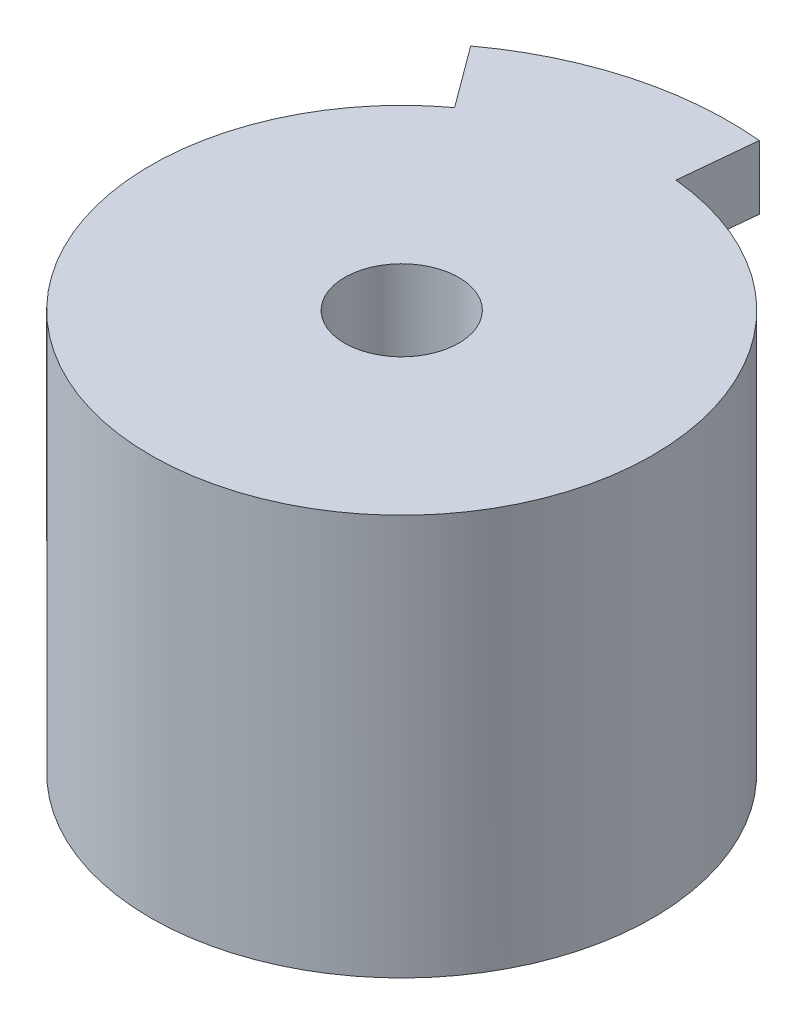
ISO-10303-21;
HEADER;
FILE_DESCRIPTION(('STEP AP214'),'2;1');
FILE_NAME('part.step','',(''),(''),'','','');
FILE_SCHEMA(('AUTOMOTIVE_DESIGN { 1 0 10303 214 1 1 1 1 }'));
ENDSEC;
DATA;
#1=APPLICATION_CONTEXT('core data for automotive mechanical design processes');
#2=APPLICATION_PROTOCOL_DEFINITION('international standard','automotive_design',2000,#1);
#3=PRODUCT_CONTEXT('',#1,'mechanical');
#4=PRODUCT('Part','Part','',(#3));
#5=PRODUCT_RELATED_PRODUCT_CATEGORY('part','',(#4));
#6=PRODUCT_DEFINITION_FORMATION('','',#4);
#7=PRODUCT_DEFINITION_CONTEXT('part definition',#1,'design');
#8=PRODUCT_DEFINITION('design','',#6,#7);
#9=PRODUCT_DEFINITION_SHAPE('','',#8);
#10=(LENGTH_UNIT() NAMED_UNIT(*) SI_UNIT(.MILLI.,.METRE.));
#11=(NAMED_UNIT(*) PLANE_ANGLE_UNIT() SI_UNIT($,.RADIAN.));
#12=(NAMED_UNIT(*) SI_UNIT($,.STERADIAN.) SOLID_ANGLE_UNIT());
#13=UNCERTAINTY_MEASURE_WITH_UNIT(LENGTH_MEASURE(1.E-05),#10,'distance_accuracy_value','');
#14=(GEOMETRIC_REPRESENTATION_CONTEXT(3) GLOBAL_UNCERTAINTY_ASSIGNED_CONTEXT((#13)) GLOBAL_UNIT_ASSIGNED_CONTEXT((#10,
#11,#12)) REPRESENTATION_CONTEXT('',''));
#15=CARTESIAN_POINT('',(0.,0.,0.));
#16=DIRECTION('',(0.,0.,1.));
#17=DIRECTION('',(1.,0.,0.));
#18=AXIS2_PLACEMENT_3D('',#15,#16,#17);
#19=CARTESIAN_POINT('',(0.,20.2,0.));
#20=DIRECTION('',(0.,-1.,0.));
#21=DIRECTION('',(0.,0.,-1.));
#22=AXIS2_PLACEMENT_3D('',#19,#20,#21);
#23=CYLINDRICAL_SURFACE('',#22,12.655);
#24=CARTESIAN_POINT('',(0.,20.2,0.));
#25=DIRECTION('',(0.,1.,0.));
#26=DIRECTION('',(0.,0.,1.));
#27=AXIS2_PLACEMENT_3D('',#24,#25,#26);
#28=CIRCLE('',#27,12.655);
#29=CARTESIAN_POINT('',(-7.51543374185751,20.2,-10.1817130519255));
#30=VERTEX_POINT('',#29);
#31=CARTESIAN_POINT('',(1.22784013172719,20.2,-12.595294105773));
#32=VERTEX_POINT('',#31);
#33=EDGE_CURVE('E47',#30,#32,#28,.T.);
#34=ORIENTED_EDGE('',*,*,#33,.F.);
#35=DIRECTION('',(0.,-1.,0.));
#36=VECTOR('',#35,1.);
#37=CARTESIAN_POINT('',(-7.51543374185751,20.2,-10.1817130519255));
#38=LINE('',#37,#36);
#39=CARTESIAN_POINT('',(-7.51543374185751,16.98,-10.1817130519255));
#40=VERTEX_POINT('',#39);
#41=EDGE_CURVE('E117',#30,#40,#38,.T.);
#42=ORIENTED_EDGE('',*,*,#41,.T.);
#43=CARTESIAN_POINT('',(0.,16.98,0.));
#44=DIRECTION('',(0.,1.,0.));
#45=DIRECTION('',(0.,0.,1.));
#46=AXIS2_PLACEMENT_3D('',#43,#44,#45);
#47=CIRCLE('',#46,12.655);
#48=CARTESIAN_POINT('',(1.22784013172719,16.98,-12.595294105773));
#49=VERTEX_POINT('',#48);
#50=EDGE_CURVE('E11',#49,#40,#47,.T.);
#51=ORIENTED_EDGE('',*,*,#50,.F.);
#52=DIRECTION('',(0.,-1.,0.));
#53=VECTOR('',#52,1.);
#54=CARTESIAN_POINT('',(1.22784013172719,20.2,-12.595294105773));
#55=LINE('',#54,#53);
#56=EDGE_CURVE('E87',#49,#32,#55,.F.);
#57=ORIENTED_EDGE('',*,*,#56,.T.);
#58=EDGE_LOOP('',(#34,#42,#51,#57));
#59=FACE_BOUND('',#58,.T.);
#60=CARTESIAN_POINT('',(0.,0.,0.));
#61=DIRECTION('',(0.,1.,0.));
#62=DIRECTION('',(0.,0.,1.));
#63=AXIS2_PLACEMENT_3D('',#60,#61,#62);
#64=CIRCLE('',#63,12.655);
#65=CARTESIAN_POINT('',(0.,0.,12.655));
#66=VERTEX_POINT('',#65);
#67=EDGE_CURVE('E121',#66,#66,#64,.T.);
#68=ORIENTED_EDGE('',*,*,#67,.T.);
#69=EDGE_LOOP('',(#68));
#70=FACE_BOUND('',#69,.T.);
#71=ADVANCED_FACE('F39',(#59,#70),#23,.T.);
#72=CARTESIAN_POINT('',(0.,20.2,0.));
#73=DIRECTION('',(0.,1.,0.));
#74=DIRECTION('',(0.,0.,1.));
#75=AXIS2_PLACEMENT_3D('',#72,#73,#74);
#76=PLANE('',#75);
#77=CARTESIAN_POINT('',(0.,20.2,0.));
#78=DIRECTION('',(0.,1.,0.));
#79=DIRECTION('',(0.,0.,1.));
#80=AXIS2_PLACEMENT_3D('',#77,#78,#79);
#81=CIRCLE('',#80,2.875);
#82=CARTESIAN_POINT('',(0.,20.2,2.875));
#83=VERTEX_POINT('',#82);
#84=EDGE_CURVE('E147',#83,#83,#81,.T.);
#85=ORIENTED_EDGE('',*,*,#84,.F.);
#86=EDGE_LOOP('',(#85));
#87=FACE_BOUND('',#86,.T.);
#88=ORIENTED_EDGE('',*,*,#33,.T.);
#89=DIRECTION('',(0.0970241115548947,0.,-0.995282031274042));
#90=VECTOR('',#89,1.);
#91=CARTESIAN_POINT('',(1.60089784065576,20.2,-16.4221535160217));
#92=LINE('',#91,#90);
#93=CARTESIAN_POINT('',(1.60089784065576,20.2,-16.4221535160217));
#94=VERTEX_POINT('',#93);
#95=EDGE_CURVE('E107',#32,#94,#92,.T.);
#96=ORIENTED_EDGE('',*,*,#95,.T.);
#97=CARTESIAN_POINT('',(0.,20.2,0.));
#98=DIRECTION('',(0.,1.,0.));
#99=DIRECTION('',(0.,0.,1.));
#100=AXIS2_PLACEMENT_3D('',#97,#98,#99);
#101=CIRCLE('',#100,16.5);
#102=CARTESIAN_POINT('',(-9.7988665934926,20.2,-13.2752481514635));
#103=VERTEX_POINT('',#102);
#104=EDGE_CURVE('E96',#94,#103,#101,.T.);
#105=ORIENTED_EDGE('',*,*,#104,.T.);
#106=DIRECTION('',(0.593870702635916,0.,0.80456049402809));
#107=VECTOR('',#106,1.);
#108=CARTESIAN_POINT('',(0.,20.2,0.));
#109=LINE('',#108,#107);
#110=EDGE_CURVE('E54',#103,#30,#109,.T.);
#111=ORIENTED_EDGE('',*,*,#110,.T.);
#112=EDGE_LOOP('',(#88,#96,#105,#111));
#113=FACE_BOUND('',#112,.T.);
#114=ADVANCED_FACE('F131',(#87,#113),#76,.T.);
#115=CARTESIAN_POINT('',(0.,0.,0.));
#116=DIRECTION('',(0.,1.,0.));
#117=DIRECTION('',(0.,0.,1.));
#118=AXIS2_PLACEMENT_3D('',#115,#116,#117);
#119=PLANE('',#118);
#120=ORIENTED_EDGE('',*,*,#67,.F.);
#121=EDGE_LOOP('',(#120));
#122=FACE_BOUND('',#121,.T.);
#123=ADVANCED_FACE('F128',(#122),#119,.F.);
#124=CARTESIAN_POINT('',(0.,16.98,0.));
#125=DIRECTION('',(-0.80456049402809,0.,0.593870702635916));
#126=DIRECTION('',(0.593870702635916,0.,0.80456049402809));
#127=AXIS2_PLACEMENT_3D('',#124,#125,#126);
#128=PLANE('',#127);
#129=ORIENTED_EDGE('',*,*,#41,.F.);
#130=ORIENTED_EDGE('',*,*,#110,.F.);
#131=DIRECTION('',(0.,1.,0.));
#132=VECTOR('',#131,1.);
#133=CARTESIAN_POINT('',(-9.7988665934926,16.98,-13.2752481514635));
#134=LINE('',#133,#132);
#135=CARTESIAN_POINT('',(-9.7988665934926,16.98,-13.2752481514635));
#136=VERTEX_POINT('',#135);
#137=EDGE_CURVE('E98',#136,#103,#134,.T.);
#138=ORIENTED_EDGE('',*,*,#137,.F.);
#139=DIRECTION('',(0.593870702635916,0.,0.80456049402809));
#140=VECTOR('',#139,1.);
#141=CARTESIAN_POINT('',(0.,16.98,0.));
#142=LINE('',#141,#140);
#143=EDGE_CURVE('E91',#136,#40,#142,.T.);
#144=ORIENTED_EDGE('',*,*,#143,.T.);
#145=EDGE_LOOP('',(#129,#130,#138,#144));
#146=FACE_BOUND('',#145,.T.);
#147=ADVANCED_FACE('F130',(#146),#128,.T.);
#148=CARTESIAN_POINT('',(1.60089784065576,16.98,-16.4221535160217));
#149=DIRECTION('',(0.995282031274042,0.,0.0970241115548947));
#150=DIRECTION('',(0.0970241115548947,0.,-0.995282031274042));
#151=AXIS2_PLACEMENT_3D('',#148,#149,#150);
#152=PLANE('',#151);
#153=ORIENTED_EDGE('',*,*,#56,.F.);
#154=DIRECTION('',(0.0970241115548947,0.,-0.995282031274042));
#155=VECTOR('',#154,1.);
#156=CARTESIAN_POINT('',(1.60089784065576,16.98,-16.4221535160217));
#157=LINE('',#156,#155);
#158=CARTESIAN_POINT('',(1.60089784065576,16.98,-16.4221535160217));
#159=VERTEX_POINT('',#158);
#160=EDGE_CURVE('E81',#49,#159,#157,.T.);
#161=ORIENTED_EDGE('',*,*,#160,.T.);
#162=DIRECTION('',(0.,1.,0.));
#163=VECTOR('',#162,1.);
#164=CARTESIAN_POINT('',(1.60089784065576,16.98,-16.4221535160217));
#165=LINE('',#164,#163);
#166=EDGE_CURVE('E84',#159,#94,#165,.T.);
#167=ORIENTED_EDGE('',*,*,#166,.T.);
#168=ORIENTED_EDGE('',*,*,#95,.F.);
#169=EDGE_LOOP('',(#153,#161,#167,#168));
#170=FACE_BOUND('',#169,.T.);
#171=ADVANCED_FACE('F83',(#170),#152,.T.);
#172=CARTESIAN_POINT('',(0.,16.98,0.));
#173=DIRECTION('',(0.,1.,0.));
#174=DIRECTION('',(0.,0.,1.));
#175=AXIS2_PLACEMENT_3D('',#172,#173,#174);
#176=CYLINDRICAL_SURFACE('',#175,16.5);
#177=ORIENTED_EDGE('',*,*,#104,.F.);
#178=ORIENTED_EDGE('',*,*,#166,.F.);
#179=CARTESIAN_POINT('',(0.,16.98,0.));
#180=DIRECTION('',(0.,1.,0.));
#181=DIRECTION('',(0.,0.,1.));
#182=AXIS2_PLACEMENT_3D('',#179,#180,#181);
#183=CIRCLE('',#182,16.5);
#184=EDGE_CURVE('E90',#159,#136,#183,.T.);
#185=ORIENTED_EDGE('',*,*,#184,.T.);
#186=ORIENTED_EDGE('',*,*,#137,.T.);
#187=EDGE_LOOP('',(#177,#178,#185,#186));
#188=FACE_BOUND('',#187,.T.);
#189=ADVANCED_FACE('F95',(#188),#176,.T.);
#190=CARTESIAN_POINT('',(0.,16.98,0.));
#191=DIRECTION('',(0.,1.,0.));
#192=DIRECTION('',(0.,0.,1.));
#193=AXIS2_PLACEMENT_3D('',#190,#191,#192);
#194=PLANE('',#193);
#195=ORIENTED_EDGE('',*,*,#160,.F.);
#196=ORIENTED_EDGE('',*,*,#50,.T.);
#197=ORIENTED_EDGE('',*,*,#143,.F.);
#198=ORIENTED_EDGE('',*,*,#184,.F.);
#199=EDGE_LOOP('',(#195,#196,#197,#198));
#200=FACE_BOUND('',#199,.T.);
#201=ADVANCED_FACE('F100',(#200),#194,.F.);
#202=CARTESIAN_POINT('',(0.,11.7,0.));
#203=DIRECTION('',(0.,1.,0.));
#204=DIRECTION('',(0.,0.,1.));
#205=AXIS2_PLACEMENT_3D('',#202,#203,#204);
#206=CYLINDRICAL_SURFACE('',#205,2.875);
#207=CARTESIAN_POINT('',(0.,11.7,0.));
#208=DIRECTION('',(0.,1.,0.));
#209=DIRECTION('',(0.,0.,1.));
#210=AXIS2_PLACEMENT_3D('',#207,#208,#209);
#211=CIRCLE('',#210,2.875);
#212=CARTESIAN_POINT('',(0.,11.7,2.875));
#213=VERTEX_POINT('',#212);
#214=EDGE_CURVE('E108',#213,#213,#211,.T.);
#215=ORIENTED_EDGE('',*,*,#214,.F.);
#216=EDGE_LOOP('',(#215));
#217=FACE_BOUND('',#216,.T.);
#218=ORIENTED_EDGE('',*,*,#84,.T.);
#219=EDGE_LOOP('',(#218));
#220=FACE_BOUND('',#219,.T.);
#221=ADVANCED_FACE('F157',(#217,#220),#206,.F.);
#222=CARTESIAN_POINT('',(0.,11.7,0.));
#223=DIRECTION('',(0.,1.,0.));
#224=DIRECTION('',(0.,0.,1.));
#225=AXIS2_PLACEMENT_3D('',#222,#223,#224);
#226=PLANE('',#225);
#227=ORIENTED_EDGE('',*,*,#214,.T.);
#228=EDGE_LOOP('',(#227));
#229=FACE_BOUND('',#228,.T.);
#230=ADVANCED_FACE('F155',(#229),#226,.T.);
#231=CLOSED_SHELL('',(#71,#114,#123,#147,#171,#189,#201,#221,#230));
#232=MANIFOLD_SOLID_BREP('B2',#231);
#233=ADVANCED_BREP_SHAPE_REPRESENTATION('',(#18,#232),#14);
#234=SHAPE_DEFINITION_REPRESENTATION(#9,#233);
ENDSEC;
END-ISO-10303-21;
